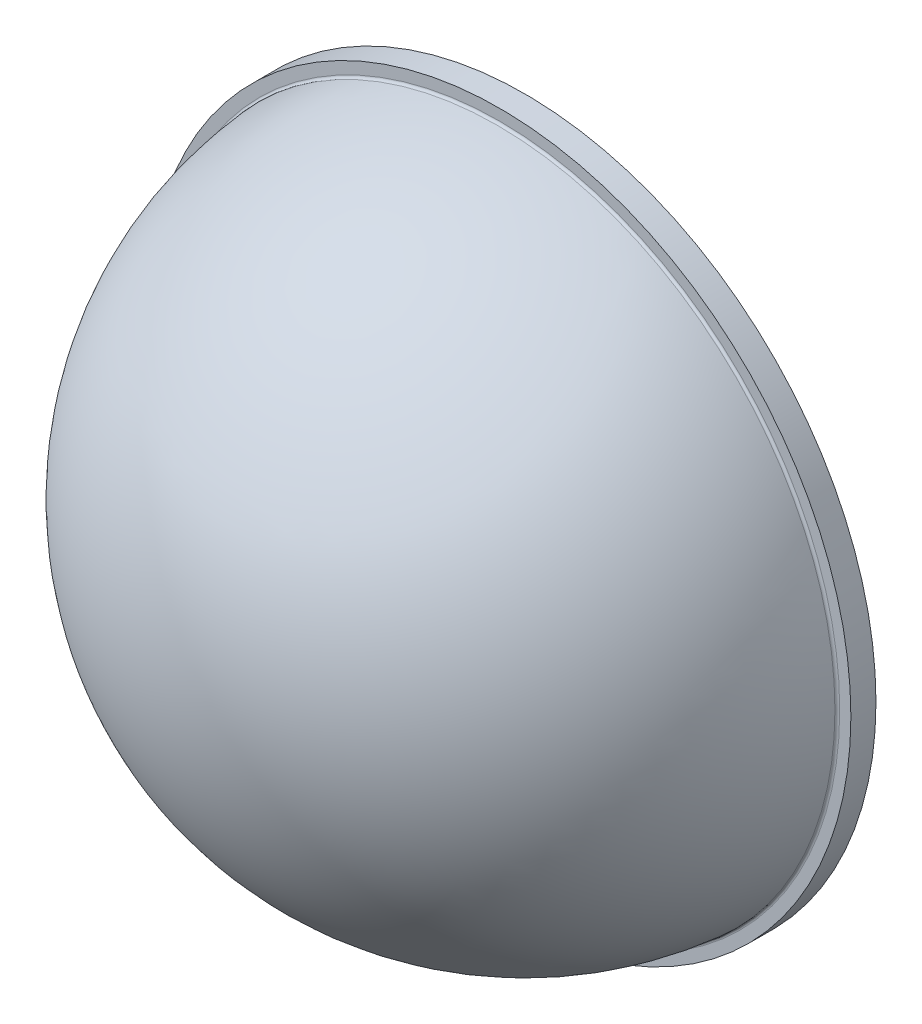
ISO-10303-21;
HEADER;
FILE_DESCRIPTION(('STEP AP214'),'2;1');
FILE_NAME('part.step','',(''),(''),'','','');
FILE_SCHEMA(('AUTOMOTIVE_DESIGN { 1 0 10303 214 1 1 1 1 }'));
ENDSEC;
DATA;
#1=APPLICATION_CONTEXT('core data for automotive mechanical design processes');
#2=APPLICATION_PROTOCOL_DEFINITION('international standard','automotive_design',2000,#1);
#3=PRODUCT_CONTEXT('',#1,'mechanical');
#4=PRODUCT('Part','Part','',(#3));
#5=PRODUCT_RELATED_PRODUCT_CATEGORY('part','',(#4));
#6=PRODUCT_DEFINITION_FORMATION('','',#4);
#7=PRODUCT_DEFINITION_CONTEXT('part definition',#1,'design');
#8=PRODUCT_DEFINITION('design','',#6,#7);
#9=PRODUCT_DEFINITION_SHAPE('','',#8);
#10=(LENGTH_UNIT() NAMED_UNIT(*) SI_UNIT(.MILLI.,.METRE.));
#11=(NAMED_UNIT(*) PLANE_ANGLE_UNIT() SI_UNIT($,.RADIAN.));
#12=(NAMED_UNIT(*) SI_UNIT($,.STERADIAN.) SOLID_ANGLE_UNIT());
#13=UNCERTAINTY_MEASURE_WITH_UNIT(LENGTH_MEASURE(1.E-05),#10,'distance_accuracy_value','');
#14=(GEOMETRIC_REPRESENTATION_CONTEXT(3) GLOBAL_UNCERTAINTY_ASSIGNED_CONTEXT((#13)) GLOBAL_UNIT_ASSIGNED_CONTEXT((#10,
#11,#12)) REPRESENTATION_CONTEXT('',''));
#15=CARTESIAN_POINT('',(0.,0.,0.));
#16=DIRECTION('',(0.,0.,1.));
#17=DIRECTION('',(1.,0.,0.));
#18=AXIS2_PLACEMENT_3D('',#15,#16,#17);
#19=CARTESIAN_POINT('',(0.,0.,5.));
#20=DIRECTION('',(0.,0.,1.));
#21=DIRECTION('',(1.,0.,0.));
#22=AXIS2_PLACEMENT_3D('',#19,#20,#21);
#23=PLANE('',#22);
#24=CARTESIAN_POINT('',(0.,0.,5.));
#25=DIRECTION('',(0.,0.,1.));
#26=DIRECTION('',(1.,0.,0.));
#27=AXIS2_PLACEMENT_3D('',#24,#25,#26);
#28=CIRCLE('',#27,67.7772085586298);
#29=CARTESIAN_POINT('',(67.7772085586298,0.,5.));
#30=VERTEX_POINT('',#29);
#31=EDGE_CURVE('E45',#30,#30,#28,.F.);
#32=ORIENTED_EDGE('',*,*,#31,.T.);
#33=EDGE_LOOP('',(#32));
#34=FACE_BOUND('',#33,.T.);
#35=CARTESIAN_POINT('',(0.,0.,5.));
#36=DIRECTION('',(0.,0.,1.));
#37=DIRECTION('',(1.,0.,0.));
#38=AXIS2_PLACEMENT_3D('',#35,#36,#37);
#39=CIRCLE('',#38,70.);
#40=CARTESIAN_POINT('',(70.,0.,5.));
#41=VERTEX_POINT('',#40);
#42=EDGE_CURVE('E50',#41,#41,#39,.T.);
#43=ORIENTED_EDGE('',*,*,#42,.T.);
#44=EDGE_LOOP('',(#43));
#45=FACE_BOUND('',#44,.T.);
#46=ADVANCED_FACE('F30',(#34,#45),#23,.T.);
#47=CARTESIAN_POINT('',(0.,0.,0.));
#48=DIRECTION('',(0.,0.,1.));
#49=DIRECTION('',(1.,0.,0.));
#50=AXIS2_PLACEMENT_3D('',#47,#48,#49);
#51=PLANE('',#50);
#52=CARTESIAN_POINT('',(0.,0.,0.));
#53=DIRECTION('',(0.,0.,1.));
#54=DIRECTION('',(1.,0.,0.));
#55=AXIS2_PLACEMENT_3D('',#52,#53,#54);
#56=CIRCLE('',#55,65.4980915752513);
#57=CARTESIAN_POINT('',(65.4980915752513,0.,0.));
#58=VERTEX_POINT('',#57);
#59=EDGE_CURVE('E37',#58,#58,#56,.T.);
#60=ORIENTED_EDGE('',*,*,#59,.T.);
#61=EDGE_LOOP('',(#60));
#62=FACE_BOUND('',#61,.T.);
#63=CARTESIAN_POINT('',(0.,0.,0.));
#64=DIRECTION('',(0.,0.,1.));
#65=DIRECTION('',(1.,0.,0.));
#66=AXIS2_PLACEMENT_3D('',#63,#64,#65);
#67=CIRCLE('',#66,70.);
#68=CARTESIAN_POINT('',(70.,0.,0.));
#69=VERTEX_POINT('',#68);
#70=EDGE_CURVE('E51',#69,#69,#67,.T.);
#71=ORIENTED_EDGE('',*,*,#70,.F.);
#72=EDGE_LOOP('',(#71));
#73=FACE_BOUND('',#72,.T.);
#74=ADVANCED_FACE('F62',(#62,#73),#51,.F.);
#75=CARTESIAN_POINT('',(0.,0.,5.));
#76=DIRECTION('',(0.,0.,-1.));
#77=DIRECTION('',(-1.,0.,0.));
#78=AXIS2_PLACEMENT_3D('',#75,#76,#77);
#79=CYLINDRICAL_SURFACE('',#78,70.);
#80=ORIENTED_EDGE('',*,*,#42,.F.);
#81=EDGE_LOOP('',(#80));
#82=FACE_BOUND('',#81,.T.);
#83=ORIENTED_EDGE('',*,*,#70,.T.);
#84=EDGE_LOOP('',(#83));
#85=FACE_BOUND('',#84,.T.);
#86=ADVANCED_FACE('F58',(#82,#85),#79,.T.);
#87=CARTESIAN_POINT('',(0.,0.,0.));
#88=DIRECTION('',(0.,1.,0.));
#89=DIRECTION('',(1.,0.,0.));
#90=AXIS2_PLACEMENT_3D('',#87,#88,#89);
#91=SPHERICAL_SURFACE('',#90,65.);
#92=CARTESIAN_POINT('',(0.,0.,0.));
#93=DIRECTION('',(0.,0.,-1.));
#94=DIRECTION('',(-1.,0.,0.));
#95=AXIS2_PLACEMENT_3D('',#92,#93,#94);
#96=SPHERICAL_SURFACE('',#95,65.);
#97=CARTESIAN_POINT('',(0.,0.,0.49618320610687));
#98=DIRECTION('',(0.,0.,-1.));
#99=DIRECTION('',(-1.,0.,0.));
#100=AXIS2_PLACEMENT_3D('',#97,#98,#99);
#101=CIRCLE('',#100,64.9981061433791);
#102=CARTESIAN_POINT('',(-64.9981061433791,0.,0.49618320610687));
#103=VERTEX_POINT('',#102);
#104=EDGE_CURVE('E10',#103,#103,#101,.T.);
#105=ORIENTED_EDGE('',*,*,#104,.T.);
#106=EDGE_LOOP('',(#105));
#107=FACE_BOUND('',#106,.T.);
#108=ADVANCED_FACE('F61',(#107),#96,.F.);
#109=CARTESIAN_POINT('',(0.,0.,0.));
#110=DIRECTION('',(0.,1.,0.));
#111=DIRECTION('',(1.,0.,0.));
#112=AXIS2_PLACEMENT_3D('',#109,#110,#111);
#113=SPHERICAL_SURFACE('',#112,67.5);
#114=CARTESIAN_POINT('',(0.,0.,0.));
#115=DIRECTION('',(0.,0.,-1.));
#116=DIRECTION('',(-1.,0.,0.));
#117=AXIS2_PLACEMENT_3D('',#114,#115,#116);
#118=SPHERICAL_SURFACE('',#117,67.5);
#119=CARTESIAN_POINT('',(0.,0.,5.45955882352941));
#120=DIRECTION('',(0.,0.,-1.));
#121=DIRECTION('',(-1.,0.,0.));
#122=AXIS2_PLACEMENT_3D('',#119,#120,#121);
#123=CIRCLE('',#122,67.2788467309928);
#124=CARTESIAN_POINT('',(-67.2788467309928,0.,5.45955882352941));
#125=VERTEX_POINT('',#124);
#126=EDGE_CURVE('E41',#125,#125,#123,.F.);
#127=ORIENTED_EDGE('',*,*,#126,.T.);
#128=EDGE_LOOP('',(#127));
#129=FACE_BOUND('',#128,.T.);
#130=ADVANCED_FACE('F76',(#129),#118,.T.);
#131=CARTESIAN_POINT('',(0.,0.,5.5));
#132=DIRECTION('',(0.,0.,1.));
#133=DIRECTION('',(1.,0.,0.));
#134=AXIS2_PLACEMENT_3D('',#131,#132,#133);
#135=TOROIDAL_SURFACE('',#134,67.7772085586298,0.5);
#136=ORIENTED_EDGE('',*,*,#126,.F.);
#137=EDGE_LOOP('',(#136));
#138=FACE_BOUND('',#137,.T.);
#139=ORIENTED_EDGE('',*,*,#31,.F.);
#140=EDGE_LOOP('',(#139));
#141=FACE_BOUND('',#140,.T.);
#142=ADVANCED_FACE('F74',(#138,#141),#135,.F.);
#143=CARTESIAN_POINT('',(0.,0.,0.5));
#144=DIRECTION('',(0.,0.,1.));
#145=DIRECTION('',(1.,0.,0.));
#146=AXIS2_PLACEMENT_3D('',#143,#144,#145);
#147=TOROIDAL_SURFACE('',#146,65.4980915752513,0.5);
#148=ORIENTED_EDGE('',*,*,#104,.F.);
#149=EDGE_LOOP('',(#148));
#150=FACE_BOUND('',#149,.T.);
#151=ORIENTED_EDGE('',*,*,#59,.F.);
#152=EDGE_LOOP('',(#151));
#153=FACE_BOUND('',#152,.T.);
#154=ADVANCED_FACE('F32',(#150,#153),#147,.T.);
#155=CLOSED_SHELL('',(#46,#74,#86,#108,#130,#142,#154));
#156=MANIFOLD_SOLID_BREP('B2',#155);
#157=ADVANCED_BREP_SHAPE_REPRESENTATION('',(#18,#156),#14);
#158=SHAPE_DEFINITION_REPRESENTATION(#9,#157);
ENDSEC;
END-ISO-10303-21;
